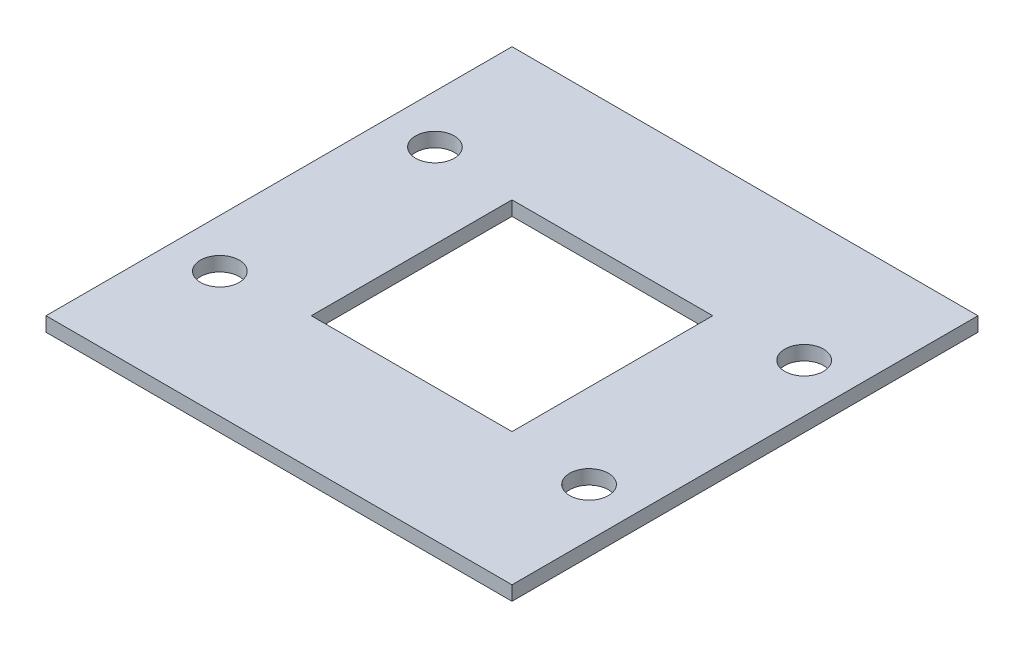
ISO-10303-21;
HEADER;
FILE_DESCRIPTION(('STEP AP214'),'2;1');
FILE_NAME('part.step','',(''),(''),'','','');
FILE_SCHEMA(('AUTOMOTIVE_DESIGN { 1 0 10303 214 1 1 1 1 }'));
ENDSEC;
DATA;
#1=APPLICATION_CONTEXT('core data for automotive mechanical design processes');
#2=APPLICATION_PROTOCOL_DEFINITION('international standard','automotive_design',2000,#1);
#3=PRODUCT_CONTEXT('',#1,'mechanical');
#4=PRODUCT('Part','Part','',(#3));
#5=PRODUCT_RELATED_PRODUCT_CATEGORY('part','',(#4));
#6=PRODUCT_DEFINITION_FORMATION('','',#4);
#7=PRODUCT_DEFINITION_CONTEXT('part definition',#1,'design');
#8=PRODUCT_DEFINITION('design','',#6,#7);
#9=PRODUCT_DEFINITION_SHAPE('','',#8);
#10=(LENGTH_UNIT() NAMED_UNIT(*) SI_UNIT(.MILLI.,.METRE.));
#11=(NAMED_UNIT(*) PLANE_ANGLE_UNIT() SI_UNIT($,.RADIAN.));
#12=(NAMED_UNIT(*) SI_UNIT($,.STERADIAN.) SOLID_ANGLE_UNIT());
#13=UNCERTAINTY_MEASURE_WITH_UNIT(LENGTH_MEASURE(1.E-05),#10,'distance_accuracy_value','');
#14=(GEOMETRIC_REPRESENTATION_CONTEXT(3) GLOBAL_UNCERTAINTY_ASSIGNED_CONTEXT((#13)) GLOBAL_UNIT_ASSIGNED_CONTEXT((#10,
#11,#12)) REPRESENTATION_CONTEXT('',''));
#15=CARTESIAN_POINT('',(0.,0.,0.));
#16=DIRECTION('',(0.,0.,1.));
#17=DIRECTION('',(1.,0.,0.));
#18=AXIS2_PLACEMENT_3D('',#15,#16,#17);
#19=CARTESIAN_POINT('',(0.,2.,0.));
#20=DIRECTION('',(0.,-1.,0.));
#21=DIRECTION('',(0.,0.,-1.));
#22=AXIS2_PLACEMENT_3D('',#19,#20,#21);
#23=PLANE('',#22);
#24=CARTESIAN_POINT('',(1.75,2.,-42.5));
#25=DIRECTION('',(0.,1.,0.));
#26=DIRECTION('',(0.,0.,1.));
#27=AXIS2_PLACEMENT_3D('',#24,#25,#26);
#28=CIRCLE('',#27,2.7);
#29=CARTESIAN_POINT('',(1.75,2.,-39.8));
#30=VERTEX_POINT('',#29);
#31=EDGE_CURVE('E318',#30,#30,#28,.T.);
#32=ORIENTED_EDGE('',*,*,#31,.F.);
#33=EDGE_LOOP('',(#32));
#34=FACE_BOUND('',#33,.T.);
#35=CARTESIAN_POINT('',(1.75,2.,-12.5));
#36=DIRECTION('',(0.,1.,0.));
#37=DIRECTION('',(0.,0.,1.));
#38=AXIS2_PLACEMENT_3D('',#35,#36,#37);
#39=CIRCLE('',#38,2.7);
#40=CARTESIAN_POINT('',(1.75,2.,-9.8));
#41=VERTEX_POINT('',#40);
#42=EDGE_CURVE('E320',#41,#41,#39,.T.);
#43=ORIENTED_EDGE('',*,*,#42,.F.);
#44=EDGE_LOOP('',(#43));
#45=FACE_BOUND('',#44,.T.);
#46=CARTESIAN_POINT('',(53.25,2.,-12.5));
#47=DIRECTION('',(0.,1.,0.));
#48=DIRECTION('',(0.,0.,1.));
#49=AXIS2_PLACEMENT_3D('',#46,#47,#48);
#50=CIRCLE('',#49,2.70000000000001);
#51=CARTESIAN_POINT('',(53.25,2.,-9.79999999999999));
#52=VERTEX_POINT('',#51);
#53=EDGE_CURVE('E331',#52,#52,#50,.T.);
#54=ORIENTED_EDGE('',*,*,#53,.F.);
#55=EDGE_LOOP('',(#54));
#56=FACE_BOUND('',#55,.T.);
#57=CARTESIAN_POINT('',(53.25,2.,-42.5));
#58=DIRECTION('',(0.,1.,0.));
#59=DIRECTION('',(0.,0.,1.));
#60=AXIS2_PLACEMENT_3D('',#57,#58,#59);
#61=CIRCLE('',#60,2.70000000000001);
#62=CARTESIAN_POINT('',(53.25,2.,-39.8));
#63=VERTEX_POINT('',#62);
#64=EDGE_CURVE('E131',#63,#63,#61,.T.);
#65=ORIENTED_EDGE('',*,*,#64,.F.);
#66=EDGE_LOOP('',(#65));
#67=FACE_BOUND('',#66,.T.);
#68=DIRECTION('',(-1.,0.,0.));
#69=VECTOR('',#68,1.);
#70=CARTESIAN_POINT('',(27.5,2.,-41.5));
#71=LINE('',#70,#69);
#72=CARTESIAN_POINT('',(41.5,2.,-41.5));
#73=VERTEX_POINT('',#72);
#74=CARTESIAN_POINT('',(13.5,2.,-41.5));
#75=VERTEX_POINT('',#74);
#76=EDGE_CURVE('E147',#73,#75,#71,.T.);
#77=ORIENTED_EDGE('',*,*,#76,.F.);
#78=DIRECTION('',(0.,0.,-1.));
#79=VECTOR('',#78,1.);
#80=CARTESIAN_POINT('',(41.5,2.,-13.5));
#81=LINE('',#80,#79);
#82=CARTESIAN_POINT('',(41.5,2.,-13.5));
#83=VERTEX_POINT('',#82);
#84=EDGE_CURVE('E154',#83,#73,#81,.T.);
#85=ORIENTED_EDGE('',*,*,#84,.F.);
#86=DIRECTION('',(1.,0.,0.));
#87=VECTOR('',#86,1.);
#88=CARTESIAN_POINT('',(13.5,2.,-13.5));
#89=LINE('',#88,#87);
#90=CARTESIAN_POINT('',(13.5,2.,-13.5));
#91=VERTEX_POINT('',#90);
#92=EDGE_CURVE('E152',#91,#83,#89,.T.);
#93=ORIENTED_EDGE('',*,*,#92,.F.);
#94=DIRECTION('',(0.,0.,1.));
#95=VECTOR('',#94,1.);
#96=CARTESIAN_POINT('',(13.5,2.,-27.5));
#97=LINE('',#96,#95);
#98=EDGE_CURVE('E149',#75,#91,#97,.T.);
#99=ORIENTED_EDGE('',*,*,#98,.F.);
#100=EDGE_LOOP('',(#77,#85,#93,#99));
#101=FACE_BOUND('',#100,.T.);
#102=DIRECTION('',(-1.,0.,0.));
#103=VECTOR('',#102,1.);
#104=CARTESIAN_POINT('',(60.,2.,-60.));
#105=LINE('',#104,#103);
#106=CARTESIAN_POINT('',(60.,2.,-60.));
#107=VERTEX_POINT('',#106);
#108=CARTESIAN_POINT('',(-5.,2.,-60.));
#109=VERTEX_POINT('',#108);
#110=EDGE_CURVE('E136',#107,#109,#105,.T.);
#111=ORIENTED_EDGE('',*,*,#110,.T.);
#112=DIRECTION('',(0.,0.,1.));
#113=VECTOR('',#112,1.);
#114=CARTESIAN_POINT('',(-5.,2.,-60.));
#115=LINE('',#114,#113);
#116=CARTESIAN_POINT('',(-5.,2.,5.));
#117=VERTEX_POINT('',#116);
#118=EDGE_CURVE('E106',#109,#117,#115,.T.);
#119=ORIENTED_EDGE('',*,*,#118,.T.);
#120=DIRECTION('',(1.,0.,0.));
#121=VECTOR('',#120,1.);
#122=CARTESIAN_POINT('',(-5.,2.,5.));
#123=LINE('',#122,#121);
#124=CARTESIAN_POINT('',(60.,2.,5.));
#125=VERTEX_POINT('',#124);
#126=EDGE_CURVE('E128',#117,#125,#123,.T.);
#127=ORIENTED_EDGE('',*,*,#126,.T.);
#128=DIRECTION('',(0.,0.,-1.));
#129=VECTOR('',#128,1.);
#130=CARTESIAN_POINT('',(60.,2.,5.));
#131=LINE('',#130,#129);
#132=EDGE_CURVE('E125',#125,#107,#131,.T.);
#133=ORIENTED_EDGE('',*,*,#132,.T.);
#134=EDGE_LOOP('',(#111,#119,#127,#133));
#135=FACE_BOUND('',#134,.T.);
#136=ADVANCED_FACE('F37',(#34,#45,#56,#67,#101,#135),#23,.F.);
#137=CARTESIAN_POINT('',(0.,0.,0.));
#138=DIRECTION('',(0.,-1.,0.));
#139=DIRECTION('',(0.,0.,-1.));
#140=AXIS2_PLACEMENT_3D('',#137,#138,#139);
#141=PLANE('',#140);
#142=CARTESIAN_POINT('',(1.75,0.,-42.5));
#143=DIRECTION('',(0.,1.,0.));
#144=DIRECTION('',(0.,0.,1.));
#145=AXIS2_PLACEMENT_3D('',#142,#143,#144);
#146=CIRCLE('',#145,2.7);
#147=CARTESIAN_POINT('',(1.75,0.,-39.8));
#148=VERTEX_POINT('',#147);
#149=EDGE_CURVE('E316',#148,#148,#146,.T.);
#150=ORIENTED_EDGE('',*,*,#149,.T.);
#151=EDGE_LOOP('',(#150));
#152=FACE_BOUND('',#151,.T.);
#153=CARTESIAN_POINT('',(1.75,0.,-12.5));
#154=DIRECTION('',(0.,1.,0.));
#155=DIRECTION('',(0.,0.,1.));
#156=AXIS2_PLACEMENT_3D('',#153,#154,#155);
#157=CIRCLE('',#156,2.7);
#158=CARTESIAN_POINT('',(1.75,0.,-9.8));
#159=VERTEX_POINT('',#158);
#160=EDGE_CURVE('E336',#159,#159,#157,.T.);
#161=ORIENTED_EDGE('',*,*,#160,.T.);
#162=EDGE_LOOP('',(#161));
#163=FACE_BOUND('',#162,.T.);
#164=CARTESIAN_POINT('',(53.25,0.,-12.5));
#165=DIRECTION('',(0.,1.,0.));
#166=DIRECTION('',(0.,0.,1.));
#167=AXIS2_PLACEMENT_3D('',#164,#165,#166);
#168=CIRCLE('',#167,2.70000000000001);
#169=CARTESIAN_POINT('',(53.25,0.,-9.79999999999999));
#170=VERTEX_POINT('',#169);
#171=EDGE_CURVE('E327',#170,#170,#168,.T.);
#172=ORIENTED_EDGE('',*,*,#171,.T.);
#173=EDGE_LOOP('',(#172));
#174=FACE_BOUND('',#173,.T.);
#175=CARTESIAN_POINT('',(53.25,0.,-42.5));
#176=DIRECTION('',(0.,1.,0.));
#177=DIRECTION('',(0.,0.,1.));
#178=AXIS2_PLACEMENT_3D('',#175,#176,#177);
#179=CIRCLE('',#178,2.70000000000001);
#180=CARTESIAN_POINT('',(53.25,0.,-39.8));
#181=VERTEX_POINT('',#180);
#182=EDGE_CURVE('E138',#181,#181,#179,.T.);
#183=ORIENTED_EDGE('',*,*,#182,.T.);
#184=EDGE_LOOP('',(#183));
#185=FACE_BOUND('',#184,.T.);
#186=DIRECTION('',(0.,0.,-1.));
#187=VECTOR('',#186,1.);
#188=CARTESIAN_POINT('',(41.5,0.,-28.15));
#189=LINE('',#188,#187);
#190=CARTESIAN_POINT('',(41.5,0.,-13.5));
#191=VERTEX_POINT('',#190);
#192=CARTESIAN_POINT('',(41.5,0.,-41.5));
#193=VERTEX_POINT('',#192);
#194=EDGE_CURVE('E150',#191,#193,#189,.T.);
#195=ORIENTED_EDGE('',*,*,#194,.T.);
#196=DIRECTION('',(-1.,0.,0.));
#197=VECTOR('',#196,1.);
#198=CARTESIAN_POINT('',(13.5,0.,-41.5));
#199=LINE('',#198,#197);
#200=CARTESIAN_POINT('',(13.5,0.,-41.5));
#201=VERTEX_POINT('',#200);
#202=EDGE_CURVE('E143',#193,#201,#199,.T.);
#203=ORIENTED_EDGE('',*,*,#202,.T.);
#204=DIRECTION('',(0.,0.,1.));
#205=VECTOR('',#204,1.);
#206=CARTESIAN_POINT('',(13.5,0.,-13.5));
#207=LINE('',#206,#205);
#208=CARTESIAN_POINT('',(13.5,0.,-13.5));
#209=VERTEX_POINT('',#208);
#210=EDGE_CURVE('E158',#201,#209,#207,.T.);
#211=ORIENTED_EDGE('',*,*,#210,.T.);
#212=DIRECTION('',(1.,0.,0.));
#213=VECTOR('',#212,1.);
#214=CARTESIAN_POINT('',(27.5,0.,-13.5));
#215=LINE('',#214,#213);
#216=EDGE_CURVE('E161',#209,#191,#215,.T.);
#217=ORIENTED_EDGE('',*,*,#216,.T.);
#218=EDGE_LOOP('',(#195,#203,#211,#217));
#219=FACE_BOUND('',#218,.T.);
#220=DIRECTION('',(-1.,0.,0.));
#221=VECTOR('',#220,1.);
#222=CARTESIAN_POINT('',(60.,0.,-60.));
#223=LINE('',#222,#221);
#224=CARTESIAN_POINT('',(60.,0.,-60.));
#225=VERTEX_POINT('',#224);
#226=CARTESIAN_POINT('',(-5.,0.,-60.));
#227=VERTEX_POINT('',#226);
#228=EDGE_CURVE('E118',#225,#227,#223,.T.);
#229=ORIENTED_EDGE('',*,*,#228,.F.);
#230=DIRECTION('',(0.,0.,-1.));
#231=VECTOR('',#230,1.);
#232=CARTESIAN_POINT('',(60.,0.,5.));
#233=LINE('',#232,#231);
#234=CARTESIAN_POINT('',(60.,0.,5.));
#235=VERTEX_POINT('',#234);
#236=EDGE_CURVE('E112',#235,#225,#233,.T.);
#237=ORIENTED_EDGE('',*,*,#236,.F.);
#238=DIRECTION('',(1.,0.,0.));
#239=VECTOR('',#238,1.);
#240=CARTESIAN_POINT('',(-5.,0.,5.));
#241=LINE('',#240,#239);
#242=CARTESIAN_POINT('',(-5.,0.,5.));
#243=VERTEX_POINT('',#242);
#244=EDGE_CURVE('E121',#243,#235,#241,.T.);
#245=ORIENTED_EDGE('',*,*,#244,.F.);
#246=DIRECTION('',(0.,0.,1.));
#247=VECTOR('',#246,1.);
#248=CARTESIAN_POINT('',(-5.,0.,-60.));
#249=LINE('',#248,#247);
#250=EDGE_CURVE('E104',#227,#243,#249,.T.);
#251=ORIENTED_EDGE('',*,*,#250,.F.);
#252=EDGE_LOOP('',(#229,#237,#245,#251));
#253=FACE_BOUND('',#252,.T.);
#254=ADVANCED_FACE('F39',(#152,#163,#174,#185,#219,#253),#141,.T.);
#255=CARTESIAN_POINT('',(13.5,2.,-41.5));
#256=DIRECTION('',(0.,0.,1.));
#257=DIRECTION('',(1.,0.,0.));
#258=AXIS2_PLACEMENT_3D('',#255,#256,#257);
#259=PLANE('',#258);
#260=ORIENTED_EDGE('',*,*,#202,.F.);
#261=DIRECTION('',(0.,-1.,0.));
#262=VECTOR('',#261,1.);
#263=CARTESIAN_POINT('',(41.5,2.,-41.5));
#264=LINE('',#263,#262);
#265=EDGE_CURVE('E57',#73,#193,#264,.T.);
#266=ORIENTED_EDGE('',*,*,#265,.F.);
#267=ORIENTED_EDGE('',*,*,#76,.T.);
#268=DIRECTION('',(0.,-1.,0.));
#269=VECTOR('',#268,1.);
#270=CARTESIAN_POINT('',(13.5,2.,-41.5));
#271=LINE('',#270,#269);
#272=EDGE_CURVE('E11',#75,#201,#271,.T.);
#273=ORIENTED_EDGE('',*,*,#272,.T.);
#274=EDGE_LOOP('',(#260,#266,#267,#273));
#275=FACE_BOUND('',#274,.T.);
#276=ADVANCED_FACE('F177',(#275),#259,.T.);
#277=CARTESIAN_POINT('',(13.5,2.,-13.5));
#278=DIRECTION('',(1.,0.,0.));
#279=DIRECTION('',(0.,0.,-1.));
#280=AXIS2_PLACEMENT_3D('',#277,#278,#279);
#281=PLANE('',#280);
#282=ORIENTED_EDGE('',*,*,#210,.F.);
#283=ORIENTED_EDGE('',*,*,#272,.F.);
#284=ORIENTED_EDGE('',*,*,#98,.T.);
#285=DIRECTION('',(0.,-1.,0.));
#286=VECTOR('',#285,1.);
#287=CARTESIAN_POINT('',(13.5,2.,-13.5));
#288=LINE('',#287,#286);
#289=EDGE_CURVE('E45',#91,#209,#288,.T.);
#290=ORIENTED_EDGE('',*,*,#289,.T.);
#291=EDGE_LOOP('',(#282,#283,#284,#290));
#292=FACE_BOUND('',#291,.T.);
#293=ADVANCED_FACE('F170',(#292),#281,.T.);
#294=CARTESIAN_POINT('',(27.5,2.,-13.5));
#295=DIRECTION('',(0.,0.,-1.));
#296=DIRECTION('',(-1.,0.,0.));
#297=AXIS2_PLACEMENT_3D('',#294,#295,#296);
#298=PLANE('',#297);
#299=ORIENTED_EDGE('',*,*,#216,.F.);
#300=ORIENTED_EDGE('',*,*,#289,.F.);
#301=ORIENTED_EDGE('',*,*,#92,.T.);
#302=DIRECTION('',(0.,-1.,0.));
#303=VECTOR('',#302,1.);
#304=CARTESIAN_POINT('',(41.5,2.,-13.5));
#305=LINE('',#304,#303);
#306=EDGE_CURVE('E52',#83,#191,#305,.T.);
#307=ORIENTED_EDGE('',*,*,#306,.T.);
#308=EDGE_LOOP('',(#299,#300,#301,#307));
#309=FACE_BOUND('',#308,.T.);
#310=ADVANCED_FACE('F182',(#309),#298,.T.);
#311=CARTESIAN_POINT('',(41.5,2.,-28.15));
#312=DIRECTION('',(-1.,0.,0.));
#313=DIRECTION('',(0.,0.,1.));
#314=AXIS2_PLACEMENT_3D('',#311,#312,#313);
#315=PLANE('',#314);
#316=ORIENTED_EDGE('',*,*,#194,.F.);
#317=ORIENTED_EDGE('',*,*,#306,.F.);
#318=ORIENTED_EDGE('',*,*,#84,.T.);
#319=ORIENTED_EDGE('',*,*,#265,.T.);
#320=EDGE_LOOP('',(#316,#317,#318,#319));
#321=FACE_BOUND('',#320,.T.);
#322=ADVANCED_FACE('F184',(#321),#315,.T.);
#323=CARTESIAN_POINT('',(60.,0.,-60.));
#324=DIRECTION('',(0.,0.,-1.));
#325=DIRECTION('',(-1.,0.,0.));
#326=AXIS2_PLACEMENT_3D('',#323,#324,#325);
#327=PLANE('',#326);
#328=ORIENTED_EDGE('',*,*,#110,.F.);
#329=DIRECTION('',(0.,1.,0.));
#330=VECTOR('',#329,1.);
#331=CARTESIAN_POINT('',(60.,0.,-60.));
#332=LINE('',#331,#330);
#333=EDGE_CURVE('E124',#225,#107,#332,.T.);
#334=ORIENTED_EDGE('',*,*,#333,.F.);
#335=ORIENTED_EDGE('',*,*,#228,.T.);
#336=DIRECTION('',(0.,1.,0.));
#337=VECTOR('',#336,1.);
#338=CARTESIAN_POINT('',(-5.,0.,-60.));
#339=LINE('',#338,#337);
#340=EDGE_CURVE('E101',#227,#109,#339,.T.);
#341=ORIENTED_EDGE('',*,*,#340,.T.);
#342=EDGE_LOOP('',(#328,#334,#335,#341));
#343=FACE_BOUND('',#342,.T.);
#344=ADVANCED_FACE('F123',(#343),#327,.T.);
#345=CARTESIAN_POINT('',(60.,0.,5.));
#346=DIRECTION('',(1.,0.,0.));
#347=DIRECTION('',(0.,0.,-1.));
#348=AXIS2_PLACEMENT_3D('',#345,#346,#347);
#349=PLANE('',#348);
#350=ORIENTED_EDGE('',*,*,#132,.F.);
#351=DIRECTION('',(0.,1.,0.));
#352=VECTOR('',#351,1.);
#353=CARTESIAN_POINT('',(60.,0.,5.));
#354=LINE('',#353,#352);
#355=EDGE_CURVE('E144',#235,#125,#354,.T.);
#356=ORIENTED_EDGE('',*,*,#355,.F.);
#357=ORIENTED_EDGE('',*,*,#236,.T.);
#358=ORIENTED_EDGE('',*,*,#333,.T.);
#359=EDGE_LOOP('',(#350,#356,#357,#358));
#360=FACE_BOUND('',#359,.T.);
#361=ADVANCED_FACE('F233',(#360),#349,.T.);
#362=CARTESIAN_POINT('',(-5.,0.,5.));
#363=DIRECTION('',(0.,0.,1.));
#364=DIRECTION('',(1.,0.,0.));
#365=AXIS2_PLACEMENT_3D('',#362,#363,#364);
#366=PLANE('',#365);
#367=ORIENTED_EDGE('',*,*,#126,.F.);
#368=DIRECTION('',(0.,1.,0.));
#369=VECTOR('',#368,1.);
#370=CARTESIAN_POINT('',(-5.,0.,5.));
#371=LINE('',#370,#369);
#372=EDGE_CURVE('E111',#243,#117,#371,.T.);
#373=ORIENTED_EDGE('',*,*,#372,.F.);
#374=ORIENTED_EDGE('',*,*,#244,.T.);
#375=ORIENTED_EDGE('',*,*,#355,.T.);
#376=EDGE_LOOP('',(#367,#373,#374,#375));
#377=FACE_BOUND('',#376,.T.);
#378=ADVANCED_FACE('F243',(#377),#366,.T.);
#379=CARTESIAN_POINT('',(-5.,0.,-60.));
#380=DIRECTION('',(-1.,0.,0.));
#381=DIRECTION('',(0.,0.,1.));
#382=AXIS2_PLACEMENT_3D('',#379,#380,#381);
#383=PLANE('',#382);
#384=ORIENTED_EDGE('',*,*,#118,.F.);
#385=ORIENTED_EDGE('',*,*,#340,.F.);
#386=ORIENTED_EDGE('',*,*,#250,.T.);
#387=ORIENTED_EDGE('',*,*,#372,.T.);
#388=EDGE_LOOP('',(#384,#385,#386,#387));
#389=FACE_BOUND('',#388,.T.);
#390=ADVANCED_FACE('F103',(#389),#383,.T.);
#391=CARTESIAN_POINT('',(53.25,0.,-42.5));
#392=DIRECTION('',(0.,1.,0.));
#393=DIRECTION('',(0.,0.,1.));
#394=AXIS2_PLACEMENT_3D('',#391,#392,#393);
#395=CYLINDRICAL_SURFACE('',#394,2.70000000000001);
#396=ORIENTED_EDGE('',*,*,#182,.F.);
#397=EDGE_LOOP('',(#396));
#398=FACE_BOUND('',#397,.T.);
#399=ORIENTED_EDGE('',*,*,#64,.T.);
#400=EDGE_LOOP('',(#399));
#401=FACE_BOUND('',#400,.T.);
#402=ADVANCED_FACE('F261',(#398,#401),#395,.F.);
#403=CARTESIAN_POINT('',(53.25,0.,-12.5));
#404=DIRECTION('',(0.,1.,0.));
#405=DIRECTION('',(0.,0.,1.));
#406=AXIS2_PLACEMENT_3D('',#403,#404,#405);
#407=CYLINDRICAL_SURFACE('',#406,2.70000000000001);
#408=ORIENTED_EDGE('',*,*,#171,.F.);
#409=EDGE_LOOP('',(#408));
#410=FACE_BOUND('',#409,.T.);
#411=ORIENTED_EDGE('',*,*,#53,.T.);
#412=EDGE_LOOP('',(#411));
#413=FACE_BOUND('',#412,.T.);
#414=ADVANCED_FACE('F279',(#410,#413),#407,.F.);
#415=CARTESIAN_POINT('',(1.75,0.,-12.5));
#416=DIRECTION('',(0.,1.,0.));
#417=DIRECTION('',(0.,0.,1.));
#418=AXIS2_PLACEMENT_3D('',#415,#416,#417);
#419=CYLINDRICAL_SURFACE('',#418,2.7);
#420=ORIENTED_EDGE('',*,*,#160,.F.);
#421=EDGE_LOOP('',(#420));
#422=FACE_BOUND('',#421,.T.);
#423=ORIENTED_EDGE('',*,*,#42,.T.);
#424=EDGE_LOOP('',(#423));
#425=FACE_BOUND('',#424,.T.);
#426=ADVANCED_FACE('F289',(#422,#425),#419,.F.);
#427=CARTESIAN_POINT('',(1.75,0.,-42.5));
#428=DIRECTION('',(0.,1.,0.));
#429=DIRECTION('',(0.,0.,1.));
#430=AXIS2_PLACEMENT_3D('',#427,#428,#429);
#431=CYLINDRICAL_SURFACE('',#430,2.7);
#432=ORIENTED_EDGE('',*,*,#149,.F.);
#433=EDGE_LOOP('',(#432));
#434=FACE_BOUND('',#433,.T.);
#435=ORIENTED_EDGE('',*,*,#31,.T.);
#436=EDGE_LOOP('',(#435));
#437=FACE_BOUND('',#436,.T.);
#438=ADVANCED_FACE('F299',(#434,#437),#431,.F.);
#439=CLOSED_SHELL('',(#136,#254,#276,#293,#310,#322,#344,#361,#378,#390,#402,#414,#426,#438));
#440=MANIFOLD_SOLID_BREP('B2',#439);
#441=ADVANCED_BREP_SHAPE_REPRESENTATION('',(#18,#440),#14);
#442=SHAPE_DEFINITION_REPRESENTATION(#9,#441);
ENDSEC;
END-ISO-10303-21;
